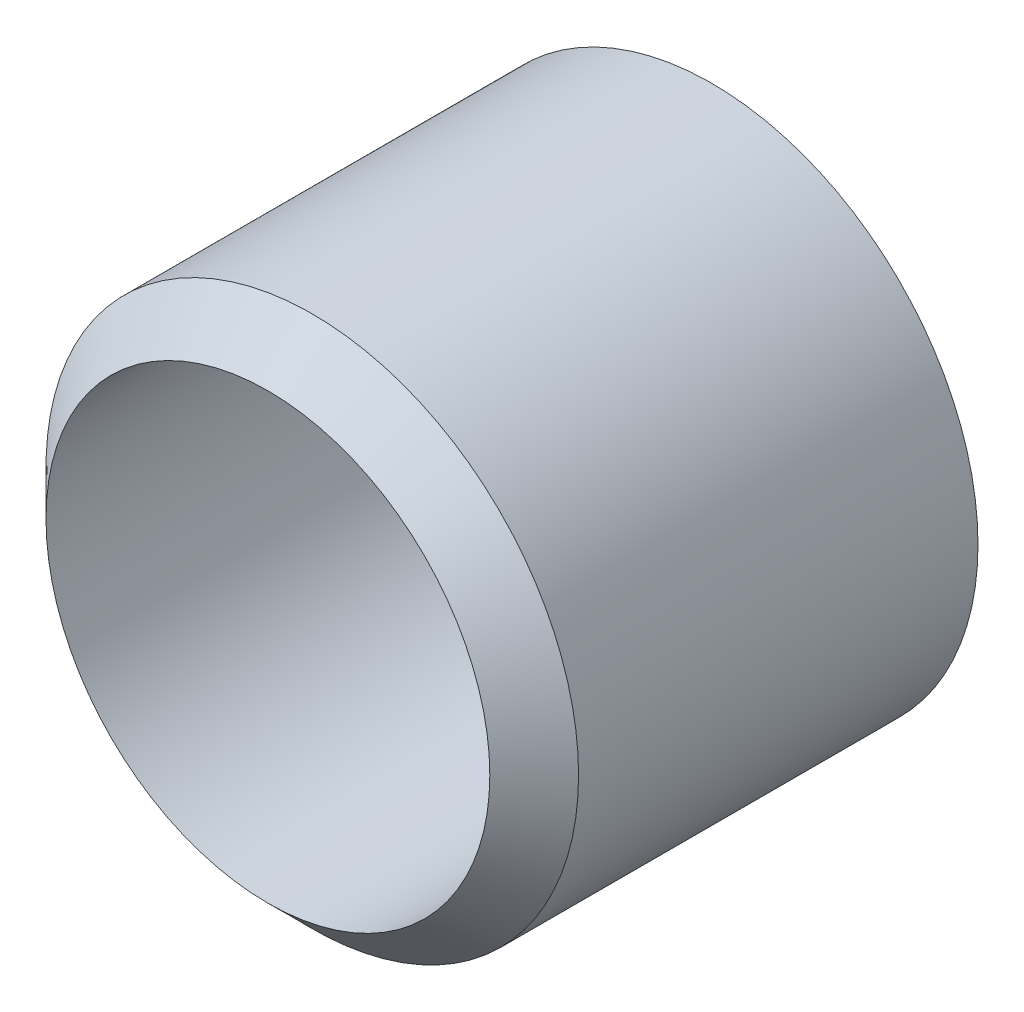
ISO-10303-21;
HEADER;
FILE_DESCRIPTION(('STEP AP214'),'2;1');
FILE_NAME('part.step','',(''),(''),'','','');
FILE_SCHEMA(('AUTOMOTIVE_DESIGN { 1 0 10303 214 1 1 1 1 }'));
ENDSEC;
DATA;
#1=APPLICATION_CONTEXT('core data for automotive mechanical design processes');
#2=APPLICATION_PROTOCOL_DEFINITION('international standard','automotive_design',2000,#1);
#3=PRODUCT_CONTEXT('',#1,'mechanical');
#4=PRODUCT('Part','Part','',(#3));
#5=PRODUCT_RELATED_PRODUCT_CATEGORY('part','',(#4));
#6=PRODUCT_DEFINITION_FORMATION('','',#4);
#7=PRODUCT_DEFINITION_CONTEXT('part definition',#1,'design');
#8=PRODUCT_DEFINITION('design','',#6,#7);
#9=PRODUCT_DEFINITION_SHAPE('','',#8);
#10=(LENGTH_UNIT() NAMED_UNIT(*) SI_UNIT(.MILLI.,.METRE.));
#11=(NAMED_UNIT(*) PLANE_ANGLE_UNIT() SI_UNIT($,.RADIAN.));
#12=(NAMED_UNIT(*) SI_UNIT($,.STERADIAN.) SOLID_ANGLE_UNIT());
#13=UNCERTAINTY_MEASURE_WITH_UNIT(LENGTH_MEASURE(1.E-05),#10,'distance_accuracy_value','');
#14=(GEOMETRIC_REPRESENTATION_CONTEXT(3) GLOBAL_UNCERTAINTY_ASSIGNED_CONTEXT((#13)) GLOBAL_UNIT_ASSIGNED_CONTEXT((#10,
#11,#12)) REPRESENTATION_CONTEXT('',''));
#15=CARTESIAN_POINT('',(0.,0.,0.));
#16=DIRECTION('',(0.,0.,1.));
#17=DIRECTION('',(1.,0.,0.));
#18=AXIS2_PLACEMENT_3D('',#15,#16,#17);
#19=CARTESIAN_POINT('',(0.,0.,0.));
#20=DIRECTION('',(0.,0.,1.));
#21=DIRECTION('',(1.,0.,0.));
#22=AXIS2_PLACEMENT_3D('',#19,#20,#21);
#23=PLANE('',#22);
#24=CARTESIAN_POINT('',(0.,0.,0.));
#25=DIRECTION('',(0.,0.,1.));
#26=DIRECTION('',(1.,0.,0.));
#27=AXIS2_PLACEMENT_3D('',#24,#25,#26);
#28=CIRCLE('',#27,300.);
#29=CARTESIAN_POINT('',(300.,0.,0.));
#30=VERTEX_POINT('',#29);
#31=EDGE_CURVE('E57',#30,#30,#28,.T.);
#32=ORIENTED_EDGE('',*,*,#31,.F.);
#33=EDGE_LOOP('',(#32));
#34=FACE_BOUND('',#33,.T.);
#35=CARTESIAN_POINT('',(0.,0.,0.));
#36=DIRECTION('',(0.,0.,1.));
#37=DIRECTION('',(1.,0.,0.));
#38=AXIS2_PLACEMENT_3D('',#35,#36,#37);
#39=CIRCLE('',#38,250.);
#40=CARTESIAN_POINT('',(250.,0.,0.));
#41=VERTEX_POINT('',#40);
#42=EDGE_CURVE('E65',#41,#41,#39,.T.);
#43=ORIENTED_EDGE('',*,*,#42,.T.);
#44=EDGE_LOOP('',(#43));
#45=FACE_BOUND('',#44,.T.);
#46=ADVANCED_FACE('F49',(#34,#45),#23,.F.);
#47=CARTESIAN_POINT('',(0.,0.,500.));
#48=DIRECTION('',(0.,0.,-1.));
#49=DIRECTION('',(-1.,0.,0.));
#50=AXIS2_PLACEMENT_3D('',#47,#48,#49);
#51=CYLINDRICAL_SURFACE('',#50,300.);
#52=CARTESIAN_POINT('',(0.,0.,450.));
#53=DIRECTION('',(0.,0.,1.));
#54=DIRECTION('',(1.,0.,0.));
#55=AXIS2_PLACEMENT_3D('',#52,#53,#54);
#56=CIRCLE('',#55,300.);
#57=CARTESIAN_POINT('',(300.,0.,450.));
#58=VERTEX_POINT('',#57);
#59=EDGE_CURVE('E12',#58,#58,#56,.F.);
#60=ORIENTED_EDGE('',*,*,#59,.T.);
#61=EDGE_LOOP('',(#60));
#62=FACE_BOUND('',#61,.T.);
#63=ORIENTED_EDGE('',*,*,#31,.T.);
#64=EDGE_LOOP('',(#63));
#65=FACE_BOUND('',#64,.T.);
#66=ADVANCED_FACE('F74',(#62,#65),#51,.T.);
#67=CARTESIAN_POINT('',(0.,0.,500.));
#68=DIRECTION('',(0.,0.,-1.));
#69=DIRECTION('',(-1.,0.,0.));
#70=AXIS2_PLACEMENT_3D('',#67,#68,#69);
#71=CYLINDRICAL_SURFACE('',#70,250.);
#72=CARTESIAN_POINT('',(0.,0.,500.));
#73=DIRECTION('',(0.,0.,1.));
#74=DIRECTION('',(1.,0.,0.));
#75=AXIS2_PLACEMENT_3D('',#72,#73,#74);
#76=CIRCLE('',#75,250.);
#77=CARTESIAN_POINT('',(250.,0.,500.));
#78=VERTEX_POINT('',#77);
#79=EDGE_CURVE('E61',#78,#78,#76,.T.);
#80=ORIENTED_EDGE('',*,*,#79,.T.);
#81=EDGE_LOOP('',(#80));
#82=FACE_BOUND('',#81,.T.);
#83=ORIENTED_EDGE('',*,*,#42,.F.);
#84=EDGE_LOOP('',(#83));
#85=FACE_BOUND('',#84,.T.);
#86=ADVANCED_FACE('F72',(#82,#85),#71,.F.);
#87=CARTESIAN_POINT('',(0.,0.,500.));
#88=DIRECTION('',(0.,0.,-1.));
#89=DIRECTION('',(-1.,0.,0.));
#90=AXIS2_PLACEMENT_3D('',#87,#88,#89);
#91=CONICAL_SURFACE('',#90,250.,0.785398163397448);
#92=ORIENTED_EDGE('',*,*,#59,.F.);
#93=EDGE_LOOP('',(#92));
#94=FACE_BOUND('',#93,.T.);
#95=ORIENTED_EDGE('',*,*,#79,.F.);
#96=EDGE_LOOP('',(#95));
#97=FACE_BOUND('',#96,.T.);
#98=ADVANCED_FACE('F52',(#94,#97),#91,.T.);
#99=CLOSED_SHELL('',(#46,#66,#86,#98));
#100=MANIFOLD_SOLID_BREP('B2',#99);
#101=ADVANCED_BREP_SHAPE_REPRESENTATION('',(#18,#100),#14);
#102=SHAPE_DEFINITION_REPRESENTATION(#9,#101);
ENDSEC;
END-ISO-10303-21;
